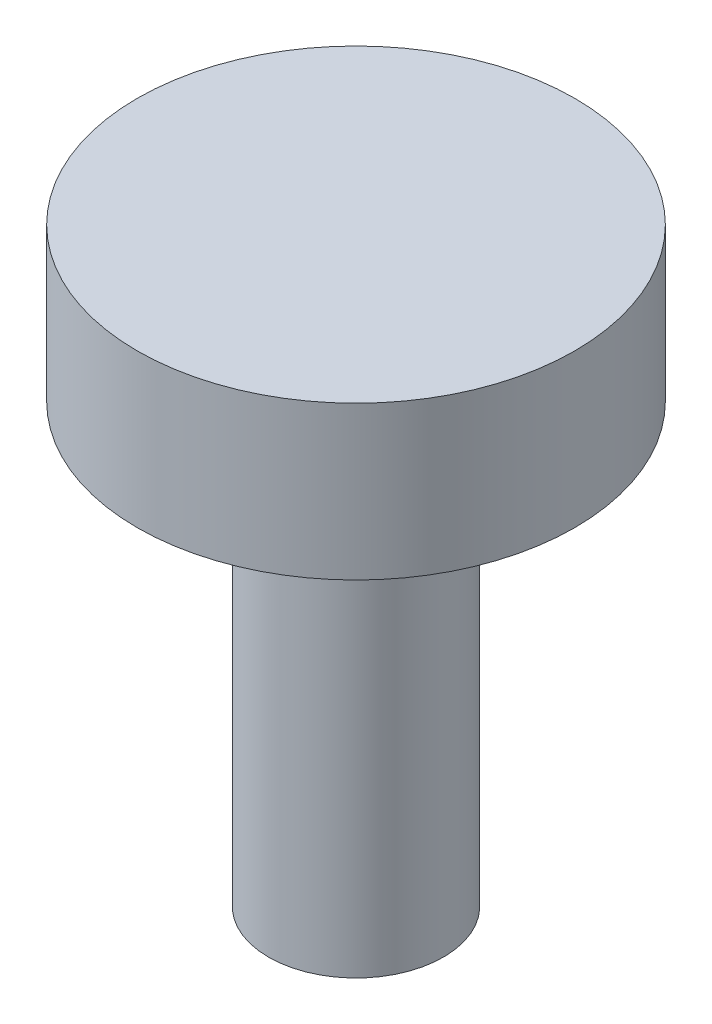
ISO-10303-21;
HEADER;
FILE_DESCRIPTION(('STEP AP214'),'2;1');
FILE_NAME('part.step','',(''),(''),'','','');
FILE_SCHEMA(('AUTOMOTIVE_DESIGN { 1 0 10303 214 1 1 1 1 }'));
ENDSEC;
DATA;
#1=APPLICATION_CONTEXT('core data for automotive mechanical design processes');
#2=APPLICATION_PROTOCOL_DEFINITION('international standard','automotive_design',2000,#1);
#3=PRODUCT_CONTEXT('',#1,'mechanical');
#4=PRODUCT('Part','Part','',(#3));
#5=PRODUCT_RELATED_PRODUCT_CATEGORY('part','',(#4));
#6=PRODUCT_DEFINITION_FORMATION('','',#4);
#7=PRODUCT_DEFINITION_CONTEXT('part definition',#1,'design');
#8=PRODUCT_DEFINITION('design','',#6,#7);
#9=PRODUCT_DEFINITION_SHAPE('','',#8);
#10=(LENGTH_UNIT() NAMED_UNIT(*) SI_UNIT(.MILLI.,.METRE.));
#11=(NAMED_UNIT(*) PLANE_ANGLE_UNIT() SI_UNIT($,.RADIAN.));
#12=(NAMED_UNIT(*) SI_UNIT($,.STERADIAN.) SOLID_ANGLE_UNIT());
#13=UNCERTAINTY_MEASURE_WITH_UNIT(LENGTH_MEASURE(1.E-05),#10,'distance_accuracy_value','');
#14=(GEOMETRIC_REPRESENTATION_CONTEXT(3) GLOBAL_UNCERTAINTY_ASSIGNED_CONTEXT((#13)) GLOBAL_UNIT_ASSIGNED_CONTEXT((#10,
#11,#12)) REPRESENTATION_CONTEXT('',''));
#15=CARTESIAN_POINT('',(0.,0.,0.));
#16=DIRECTION('',(0.,0.,1.));
#17=DIRECTION('',(1.,0.,0.));
#18=AXIS2_PLACEMENT_3D('',#15,#16,#17);
#19=CARTESIAN_POINT('',(0.,7.,0.));
#20=DIRECTION('',(0.,-1.,0.));
#21=DIRECTION('',(0.,0.,-1.));
#22=AXIS2_PLACEMENT_3D('',#19,#20,#21);
#23=CYLINDRICAL_SURFACE('',#22,10.);
#24=CARTESIAN_POINT('',(0.,7.,0.));
#25=DIRECTION('',(0.,1.,0.));
#26=DIRECTION('',(0.,0.,1.));
#27=AXIS2_PLACEMENT_3D('',#24,#25,#26);
#28=CIRCLE('',#27,10.);
#29=CARTESIAN_POINT('',(0.,7.,10.));
#30=VERTEX_POINT('',#29);
#31=EDGE_CURVE('E10',#30,#30,#28,.T.);
#32=ORIENTED_EDGE('',*,*,#31,.F.);
#33=EDGE_LOOP('',(#32));
#34=FACE_BOUND('',#33,.T.);
#35=CARTESIAN_POINT('',(0.,0.,0.));
#36=DIRECTION('',(0.,1.,0.));
#37=DIRECTION('',(0.,0.,1.));
#38=AXIS2_PLACEMENT_3D('',#35,#36,#37);
#39=CIRCLE('',#38,10.);
#40=CARTESIAN_POINT('',(0.,0.,10.));
#41=VERTEX_POINT('',#40);
#42=EDGE_CURVE('E40',#41,#41,#39,.T.);
#43=ORIENTED_EDGE('',*,*,#42,.T.);
#44=EDGE_LOOP('',(#43));
#45=FACE_BOUND('',#44,.T.);
#46=ADVANCED_FACE('F37',(#34,#45),#23,.T.);
#47=CARTESIAN_POINT('',(0.,7.,0.));
#48=DIRECTION('',(0.,1.,0.));
#49=DIRECTION('',(0.,0.,1.));
#50=AXIS2_PLACEMENT_3D('',#47,#48,#49);
#51=PLANE('',#50);
#52=ORIENTED_EDGE('',*,*,#31,.T.);
#53=EDGE_LOOP('',(#52));
#54=FACE_BOUND('',#53,.T.);
#55=ADVANCED_FACE('F67',(#54),#51,.T.);
#56=CARTESIAN_POINT('',(0.,0.,0.));
#57=DIRECTION('',(0.,1.,0.));
#58=DIRECTION('',(0.,0.,1.));
#59=AXIS2_PLACEMENT_3D('',#56,#57,#58);
#60=PLANE('',#59);
#61=CARTESIAN_POINT('',(0.,0.,0.));
#62=DIRECTION('',(0.,1.,0.));
#63=DIRECTION('',(0.,0.,1.));
#64=AXIS2_PLACEMENT_3D('',#61,#62,#63);
#65=CIRCLE('',#64,4.);
#66=CARTESIAN_POINT('',(0.,0.,4.));
#67=VERTEX_POINT('',#66);
#68=EDGE_CURVE('E49',#67,#67,#65,.T.);
#69=ORIENTED_EDGE('',*,*,#68,.T.);
#70=EDGE_LOOP('',(#69));
#71=FACE_BOUND('',#70,.T.);
#72=ORIENTED_EDGE('',*,*,#42,.F.);
#73=EDGE_LOOP('',(#72));
#74=FACE_BOUND('',#73,.T.);
#75=ADVANCED_FACE('F64',(#71,#74),#60,.F.);
#76=CARTESIAN_POINT('',(0.,-20.,0.));
#77=DIRECTION('',(0.,1.,0.));
#78=DIRECTION('',(0.,0.,1.));
#79=AXIS2_PLACEMENT_3D('',#76,#77,#78);
#80=CYLINDRICAL_SURFACE('',#79,4.);
#81=CARTESIAN_POINT('',(0.,-20.,0.));
#82=DIRECTION('',(0.,1.,0.));
#83=DIRECTION('',(0.,0.,1.));
#84=AXIS2_PLACEMENT_3D('',#81,#82,#83);
#85=CIRCLE('',#84,4.);
#86=CARTESIAN_POINT('',(0.,-20.,4.));
#87=VERTEX_POINT('',#86);
#88=EDGE_CURVE('E47',#87,#87,#85,.T.);
#89=ORIENTED_EDGE('',*,*,#88,.T.);
#90=EDGE_LOOP('',(#89));
#91=FACE_BOUND('',#90,.T.);
#92=ORIENTED_EDGE('',*,*,#68,.F.);
#93=EDGE_LOOP('',(#92));
#94=FACE_BOUND('',#93,.T.);
#95=ADVANCED_FACE('F55',(#91,#94),#80,.T.);
#96=CARTESIAN_POINT('',(0.,-20.,0.));
#97=DIRECTION('',(0.,1.,0.));
#98=DIRECTION('',(0.,0.,1.));
#99=AXIS2_PLACEMENT_3D('',#96,#97,#98);
#100=PLANE('',#99);
#101=ORIENTED_EDGE('',*,*,#88,.F.);
#102=EDGE_LOOP('',(#101));
#103=FACE_BOUND('',#102,.T.);
#104=ADVANCED_FACE('F58',(#103),#100,.F.);
#105=CLOSED_SHELL('',(#46,#55,#75,#95,#104));
#106=MANIFOLD_SOLID_BREP('B2',#105);
#107=ADVANCED_BREP_SHAPE_REPRESENTATION('',(#18,#106),#14);
#108=SHAPE_DEFINITION_REPRESENTATION(#9,#107);
ENDSEC;
END-ISO-10303-21;
